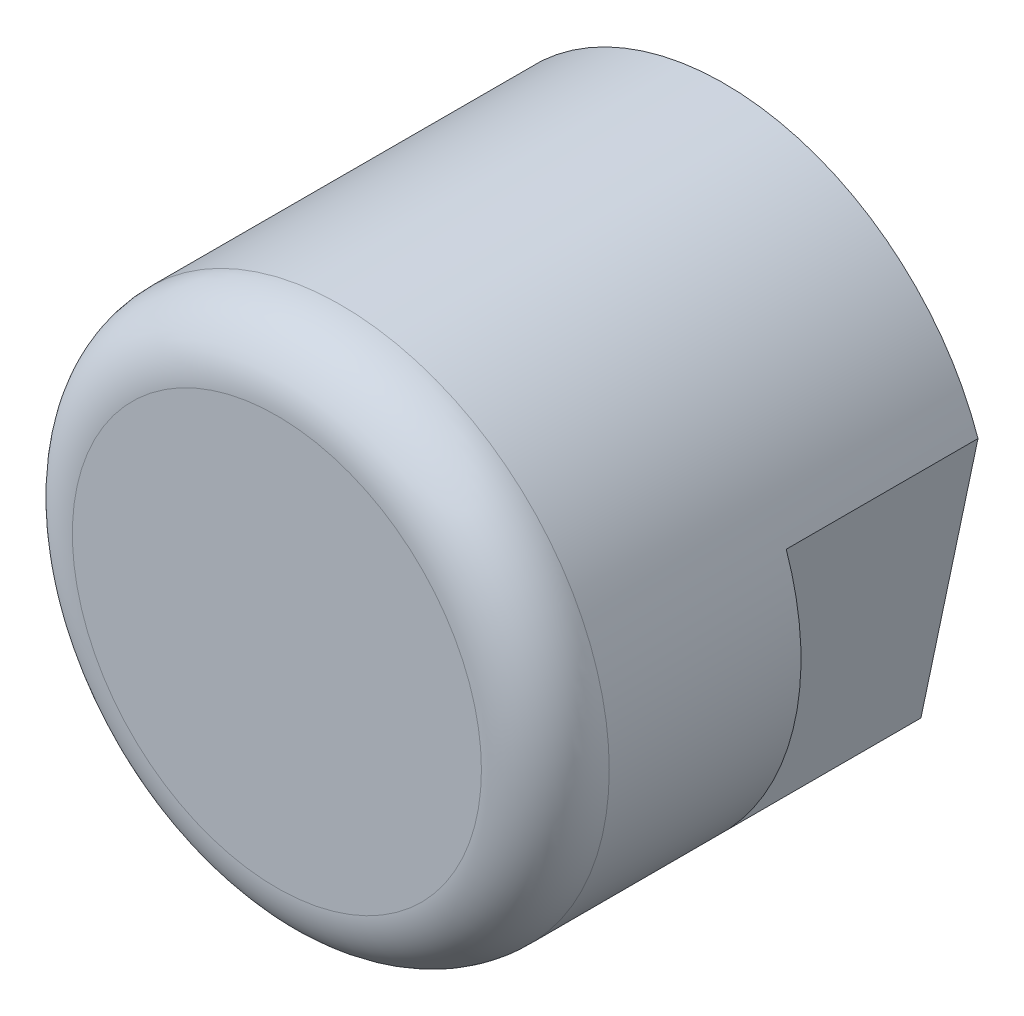
ISO-10303-21;
HEADER;
FILE_DESCRIPTION(('STEP AP214'),'2;1');
FILE_NAME('part.step','',(''),(''),'','','');
FILE_SCHEMA(('AUTOMOTIVE_DESIGN { 1 0 10303 214 1 1 1 1 }'));
ENDSEC;
DATA;
#1=APPLICATION_CONTEXT('core data for automotive mechanical design processes');
#2=APPLICATION_PROTOCOL_DEFINITION('international standard','automotive_design',2000,#1);
#3=PRODUCT_CONTEXT('',#1,'mechanical');
#4=PRODUCT('Part','Part','',(#3));
#5=PRODUCT_RELATED_PRODUCT_CATEGORY('part','',(#4));
#6=PRODUCT_DEFINITION_FORMATION('','',#4);
#7=PRODUCT_DEFINITION_CONTEXT('part definition',#1,'design');
#8=PRODUCT_DEFINITION('design','',#6,#7);
#9=PRODUCT_DEFINITION_SHAPE('','',#8);
#10=(LENGTH_UNIT() NAMED_UNIT(*) SI_UNIT(.MILLI.,.METRE.));
#11=(NAMED_UNIT(*) PLANE_ANGLE_UNIT() SI_UNIT($,.RADIAN.));
#12=(NAMED_UNIT(*) SI_UNIT($,.STERADIAN.) SOLID_ANGLE_UNIT());
#13=UNCERTAINTY_MEASURE_WITH_UNIT(LENGTH_MEASURE(1.E-05),#10,'distance_accuracy_value','');
#14=(GEOMETRIC_REPRESENTATION_CONTEXT(3) GLOBAL_UNCERTAINTY_ASSIGNED_CONTEXT((#13)) GLOBAL_UNIT_ASSIGNED_CONTEXT((#10,
#11,#12)) REPRESENTATION_CONTEXT('',''));
#15=CARTESIAN_POINT('',(0.,0.,0.));
#16=DIRECTION('',(0.,0.,1.));
#17=DIRECTION('',(1.,0.,0.));
#18=AXIS2_PLACEMENT_3D('',#15,#16,#17);
#19=CARTESIAN_POINT('',(0.,0.,35.));
#20=DIRECTION('',(0.,0.,1.));
#21=DIRECTION('',(1.,0.,0.));
#22=AXIS2_PLACEMENT_3D('',#19,#20,#21);
#23=TOROIDAL_SURFACE('',#22,16.,5.);
#24=CARTESIAN_POINT('',(0.,0.,40.));
#25=DIRECTION('',(0.,0.,1.));
#26=DIRECTION('',(1.,0.,0.));
#27=AXIS2_PLACEMENT_3D('',#24,#25,#26);
#28=CIRCLE('',#27,16.);
#29=CARTESIAN_POINT('',(16.,0.,40.));
#30=VERTEX_POINT('',#29);
#31=EDGE_CURVE('E40',#30,#30,#28,.T.);
#32=ORIENTED_EDGE('',*,*,#31,.F.);
#33=EDGE_LOOP('',(#32));
#34=FACE_BOUND('',#33,.T.);
#35=CARTESIAN_POINT('',(0.,0.,35.));
#36=DIRECTION('',(0.,0.,1.));
#37=DIRECTION('',(1.,0.,0.));
#38=AXIS2_PLACEMENT_3D('',#35,#36,#37);
#39=CIRCLE('',#38,21.);
#40=CARTESIAN_POINT('',(21.,0.,35.));
#41=VERTEX_POINT('',#40);
#42=EDGE_CURVE('E11',#41,#41,#39,.F.);
#43=ORIENTED_EDGE('',*,*,#42,.F.);
#44=EDGE_LOOP('',(#43));
#45=FACE_BOUND('',#44,.T.);
#46=ADVANCED_FACE('F33',(#34,#45),#23,.T.);
#47=CARTESIAN_POINT('',(0.,0.,40.));
#48=DIRECTION('',(0.,0.,-1.));
#49=DIRECTION('',(-1.,0.,0.));
#50=AXIS2_PLACEMENT_3D('',#47,#48,#49);
#51=CYLINDRICAL_SURFACE('',#50,21.);
#52=ORIENTED_EDGE('',*,*,#42,.T.);
#53=EDGE_LOOP('',(#52));
#54=FACE_BOUND('',#53,.T.);
#55=DIRECTION('',(0.,0.,-1.));
#56=VECTOR('',#55,1.);
#57=CARTESIAN_POINT('',(15.3792575616426,-14.2995956884332,20.));
#58=LINE('',#57,#56);
#59=CARTESIAN_POINT('',(15.3792575616426,-14.2995956884332,20.));
#60=VERTEX_POINT('',#59);
#61=CARTESIAN_POINT('',(15.3792575616426,-14.2995956884332,5.));
#62=VERTEX_POINT('',#61);
#63=EDGE_CURVE('E47',#60,#62,#58,.T.);
#64=ORIENTED_EDGE('',*,*,#63,.F.);
#65=CARTESIAN_POINT('',(0.,0.,20.));
#66=DIRECTION('',(0.,0.,1.));
#67=DIRECTION('',(0.914763971929934,-0.4039887073409,0.));
#68=AXIS2_PLACEMENT_3D('',#65,#66,#67);
#69=CIRCLE('',#68,21.);
#70=CARTESIAN_POINT('',(19.8452659100893,6.86770856675255,20.));
#71=VERTEX_POINT('',#70);
#72=EDGE_CURVE('E80',#60,#71,#69,.T.);
#73=ORIENTED_EDGE('',*,*,#72,.T.);
#74=DIRECTION('',(0.,0.,-1.));
#75=VECTOR('',#74,1.);
#76=CARTESIAN_POINT('',(19.8452659100893,6.86770856675255,20.));
#77=LINE('',#76,#75);
#78=CARTESIAN_POINT('',(19.8452659100893,6.86770856675255,5.));
#79=VERTEX_POINT('',#78);
#80=EDGE_CURVE('E77',#71,#79,#77,.T.);
#81=ORIENTED_EDGE('',*,*,#80,.T.);
#82=CARTESIAN_POINT('',(0.,0.,5.));
#83=DIRECTION('',(0.,0.,-1.));
#84=DIRECTION('',(-1.,0.,0.));
#85=AXIS2_PLACEMENT_3D('',#82,#83,#84);
#86=CIRCLE('',#85,21.);
#87=CARTESIAN_POINT('',(-15.3792575616427,14.2995956884332,5.));
#88=VERTEX_POINT('',#87);
#89=EDGE_CURVE('E108',#88,#79,#86,.T.);
#90=ORIENTED_EDGE('',*,*,#89,.F.);
#91=DIRECTION('',(0.,0.,-1.));
#92=VECTOR('',#91,1.);
#93=CARTESIAN_POINT('',(-15.3792575616426,14.2995956884332,20.));
#94=LINE('',#93,#92);
#95=CARTESIAN_POINT('',(-15.3792575616426,14.2995956884332,20.));
#96=VERTEX_POINT('',#95);
#97=EDGE_CURVE('E55',#96,#88,#94,.T.);
#98=ORIENTED_EDGE('',*,*,#97,.F.);
#99=CARTESIAN_POINT('',(0.,0.,20.));
#100=DIRECTION('',(0.,0.,-1.));
#101=DIRECTION('',(-1.,0.,0.));
#102=AXIS2_PLACEMENT_3D('',#99,#100,#101);
#103=CIRCLE('',#102,21.);
#104=CARTESIAN_POINT('',(-19.8452659100893,-6.86770856675255,20.));
#105=VERTEX_POINT('',#104);
#106=EDGE_CURVE('E95',#105,#96,#103,.T.);
#107=ORIENTED_EDGE('',*,*,#106,.F.);
#108=DIRECTION('',(0.,0.,-1.));
#109=VECTOR('',#108,1.);
#110=CARTESIAN_POINT('',(-19.8452659100893,-6.86770856675255,20.));
#111=LINE('',#110,#109);
#112=CARTESIAN_POINT('',(-19.8452659100893,-6.86770856675255,5.));
#113=VERTEX_POINT('',#112);
#114=EDGE_CURVE('E101',#105,#113,#111,.T.);
#115=ORIENTED_EDGE('',*,*,#114,.T.);
#116=EDGE_CURVE('E89',#62,#113,#86,.T.);
#117=ORIENTED_EDGE('',*,*,#116,.F.);
#118=EDGE_LOOP('',(#64,#73,#81,#90,#98,#107,#115,#117));
#119=FACE_BOUND('',#118,.T.);
#120=ADVANCED_FACE('F87',(#54,#119),#51,.T.);
#121=CARTESIAN_POINT('',(0.,0.,5.));
#122=DIRECTION('',(0.,0.,-1.));
#123=DIRECTION('',(-1.,0.,0.));
#124=AXIS2_PLACEMENT_3D('',#121,#122,#123);
#125=PLANE('',#124);
#126=CARTESIAN_POINT('',(0.,0.,5.));
#127=DIRECTION('',(0.,0.,-1.));
#128=DIRECTION('',(-1.,0.,0.));
#129=AXIS2_PLACEMENT_3D('',#126,#127,#128);
#130=CIRCLE('',#129,10.);
#131=CARTESIAN_POINT('',(-10.,0.,5.));
#132=VERTEX_POINT('',#131);
#133=EDGE_CURVE('E105',#132,#132,#130,.T.);
#134=ORIENTED_EDGE('',*,*,#133,.F.);
#135=EDGE_LOOP('',(#134));
#136=FACE_BOUND('',#135,.T.);
#137=ORIENTED_EDGE('',*,*,#89,.T.);
#138=DIRECTION('',(-0.206441308935574,-0.978458985325889,0.));
#139=VECTOR('',#138,1.);
#140=CARTESIAN_POINT('',(19.8452659100893,6.86770856675255,5.));
#141=LINE('',#140,#139);
#142=EDGE_CURVE('E84',#79,#62,#141,.T.);
#143=ORIENTED_EDGE('',*,*,#142,.T.);
#144=ORIENTED_EDGE('',*,*,#116,.T.);
#145=DIRECTION('',(-0.206441308935574,-0.978458985325888,0.));
#146=VECTOR('',#145,1.);
#147=CARTESIAN_POINT('',(-15.3792575616426,14.2995956884332,5.));
#148=LINE('',#147,#146);
#149=EDGE_CURVE('E91',#88,#113,#148,.T.);
#150=ORIENTED_EDGE('',*,*,#149,.F.);
#151=EDGE_LOOP('',(#137,#143,#144,#150));
#152=FACE_BOUND('',#151,.T.);
#153=ADVANCED_FACE('F122',(#136,#152),#125,.T.);
#154=CARTESIAN_POINT('',(0.,0.,40.));
#155=DIRECTION('',(0.,0.,1.));
#156=DIRECTION('',(1.,0.,0.));
#157=AXIS2_PLACEMENT_3D('',#154,#155,#156);
#158=PLANE('',#157);
#159=ORIENTED_EDGE('',*,*,#31,.T.);
#160=EDGE_LOOP('',(#159));
#161=FACE_BOUND('',#160,.T.);
#162=ADVANCED_FACE('F115',(#161),#158,.T.);
#163=CARTESIAN_POINT('',(0.,0.,5.));
#164=DIRECTION('',(0.,0.,-1.));
#165=DIRECTION('',(-1.,0.,0.));
#166=AXIS2_PLACEMENT_3D('',#163,#164,#165);
#167=CYLINDRICAL_SURFACE('',#166,10.);
#168=ORIENTED_EDGE('',*,*,#133,.T.);
#169=EDGE_LOOP('',(#168));
#170=FACE_BOUND('',#169,.T.);
#171=CARTESIAN_POINT('',(0.,0.,0.));
#172=DIRECTION('',(0.,0.,-1.));
#173=DIRECTION('',(-1.,0.,0.));
#174=AXIS2_PLACEMENT_3D('',#171,#172,#173);
#175=CIRCLE('',#174,10.);
#176=CARTESIAN_POINT('',(-10.,0.,0.));
#177=VERTEX_POINT('',#176);
#178=EDGE_CURVE('E103',#177,#177,#175,.T.);
#179=ORIENTED_EDGE('',*,*,#178,.F.);
#180=EDGE_LOOP('',(#179));
#181=FACE_BOUND('',#180,.T.);
#182=ADVANCED_FACE('F133',(#170,#181),#167,.T.);
#183=CARTESIAN_POINT('',(0.,0.,0.));
#184=DIRECTION('',(0.,0.,1.));
#185=DIRECTION('',(1.,0.,0.));
#186=AXIS2_PLACEMENT_3D('',#183,#184,#185);
#187=PLANE('',#186);
#188=CARTESIAN_POINT('',(0.,0.,0.));
#189=DIRECTION('',(0.,0.,-1.));
#190=DIRECTION('',(-1.,0.,0.));
#191=AXIS2_PLACEMENT_3D('',#188,#189,#190);
#192=CIRCLE('',#191,4.5);
#193=CARTESIAN_POINT('',(-4.5,0.,0.));
#194=VERTEX_POINT('',#193);
#195=EDGE_CURVE('E162',#194,#194,#192,.T.);
#196=ORIENTED_EDGE('',*,*,#195,.F.);
#197=EDGE_LOOP('',(#196));
#198=FACE_BOUND('',#197,.T.);
#199=ORIENTED_EDGE('',*,*,#178,.T.);
#200=EDGE_LOOP('',(#199));
#201=FACE_BOUND('',#200,.T.);
#202=ADVANCED_FACE('F129',(#198,#201),#187,.F.);
#203=CARTESIAN_POINT('',(-15.3792575616426,14.2995956884332,20.));
#204=DIRECTION('',(0.978458985325888,-0.206441308935574,0.));
#205=DIRECTION('',(0.206441308935574,0.978458985325888,0.));
#206=AXIS2_PLACEMENT_3D('',#203,#204,#205);
#207=PLANE('',#206);
#208=ORIENTED_EDGE('',*,*,#149,.T.);
#209=ORIENTED_EDGE('',*,*,#114,.F.);
#210=DIRECTION('',(-0.206441308935574,-0.978458985325888,0.));
#211=VECTOR('',#210,1.);
#212=CARTESIAN_POINT('',(-15.3792575616426,14.2995956884332,20.));
#213=LINE('',#212,#211);
#214=EDGE_CURVE('E97',#96,#105,#213,.T.);
#215=ORIENTED_EDGE('',*,*,#214,.F.);
#216=ORIENTED_EDGE('',*,*,#97,.T.);
#217=EDGE_LOOP('',(#208,#209,#215,#216));
#218=FACE_BOUND('',#217,.T.);
#219=ADVANCED_FACE('F132',(#218),#207,.F.);
#220=CARTESIAN_POINT('',(0.,0.,20.));
#221=DIRECTION('',(0.,0.,-1.));
#222=DIRECTION('',(-1.,0.,0.));
#223=AXIS2_PLACEMENT_3D('',#220,#221,#222);
#224=PLANE('',#223);
#225=ORIENTED_EDGE('',*,*,#106,.T.);
#226=ORIENTED_EDGE('',*,*,#214,.T.);
#227=EDGE_LOOP('',(#225,#226));
#228=FACE_BOUND('',#227,.T.);
#229=ADVANCED_FACE('F142',(#228),#224,.T.);
#230=CARTESIAN_POINT('',(19.8452659100893,6.86770856675255,20.));
#231=DIRECTION('',(0.978458985325888,-0.206441308935574,0.));
#232=DIRECTION('',(0.206441308935574,0.978458985325888,0.));
#233=AXIS2_PLACEMENT_3D('',#230,#231,#232);
#234=PLANE('',#233);
#235=ORIENTED_EDGE('',*,*,#142,.F.);
#236=ORIENTED_EDGE('',*,*,#80,.F.);
#237=DIRECTION('',(-0.206441308935574,-0.978458985325889,0.));
#238=VECTOR('',#237,1.);
#239=CARTESIAN_POINT('',(19.8452659100893,6.86770856675255,20.));
#240=LINE('',#239,#238);
#241=EDGE_CURVE('E73',#71,#60,#240,.T.);
#242=ORIENTED_EDGE('',*,*,#241,.T.);
#243=ORIENTED_EDGE('',*,*,#63,.T.);
#244=EDGE_LOOP('',(#235,#236,#242,#243));
#245=FACE_BOUND('',#244,.T.);
#246=ADVANCED_FACE('F75',(#245),#234,.T.);
#247=CARTESIAN_POINT('',(0.,0.,20.));
#248=DIRECTION('',(0.,0.,-1.));
#249=DIRECTION('',(0.914763971929934,-0.4039887073409,0.));
#250=AXIS2_PLACEMENT_3D('',#247,#248,#249);
#251=PLANE('',#250);
#252=ORIENTED_EDGE('',*,*,#72,.F.);
#253=ORIENTED_EDGE('',*,*,#241,.F.);
#254=EDGE_LOOP('',(#252,#253));
#255=FACE_BOUND('',#254,.T.);
#256=ADVANCED_FACE('F82',(#255),#251,.T.);
#257=CARTESIAN_POINT('',(0.,0.,10.));
#258=DIRECTION('',(0.,0.,-1.));
#259=DIRECTION('',(-1.,0.,0.));
#260=AXIS2_PLACEMENT_3D('',#257,#258,#259);
#261=CYLINDRICAL_SURFACE('',#260,4.5);
#262=CARTESIAN_POINT('',(0.,0.,10.));
#263=DIRECTION('',(0.,0.,-1.));
#264=DIRECTION('',(-1.,0.,0.));
#265=AXIS2_PLACEMENT_3D('',#262,#263,#264);
#266=CIRCLE('',#265,4.5);
#267=CARTESIAN_POINT('',(-4.5,0.,10.));
#268=VERTEX_POINT('',#267);
#269=EDGE_CURVE('E161',#268,#268,#266,.T.);
#270=ORIENTED_EDGE('',*,*,#269,.F.);
#271=EDGE_LOOP('',(#270));
#272=FACE_BOUND('',#271,.T.);
#273=ORIENTED_EDGE('',*,*,#195,.T.);
#274=EDGE_LOOP('',(#273));
#275=FACE_BOUND('',#274,.T.);
#276=ADVANCED_FACE('F150',(#272,#275),#261,.F.);
#277=CARTESIAN_POINT('',(0.,0.,10.));
#278=DIRECTION('',(0.,0.,-1.));
#279=DIRECTION('',(-1.,0.,0.));
#280=AXIS2_PLACEMENT_3D('',#277,#278,#279);
#281=PLANE('',#280);
#282=ORIENTED_EDGE('',*,*,#269,.T.);
#283=EDGE_LOOP('',(#282));
#284=FACE_BOUND('',#283,.T.);
#285=ADVANCED_FACE('F153',(#284),#281,.T.);
#286=CLOSED_SHELL('',(#46,#120,#153,#162,#182,#202,#219,#229,#246,#256,#276,#285));
#287=MANIFOLD_SOLID_BREP('B2',#286);
#288=ADVANCED_BREP_SHAPE_REPRESENTATION('',(#18,#287),#14);
#289=SHAPE_DEFINITION_REPRESENTATION(#9,#288);
ENDSEC;
END-ISO-10303-21;
